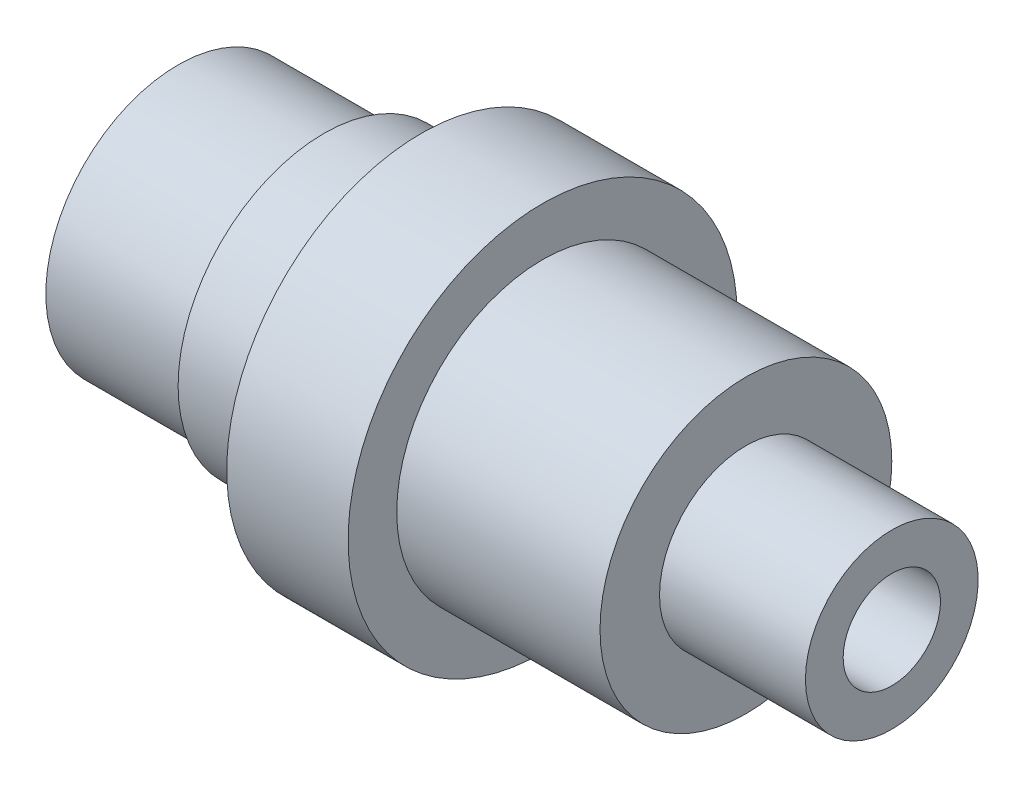
ISO-10303-21;
HEADER;
FILE_DESCRIPTION(('STEP AP214'),'2;1');
FILE_NAME('part.step','',(''),(''),'','','');
FILE_SCHEMA(('AUTOMOTIVE_DESIGN { 1 0 10303 214 1 1 1 1 }'));
ENDSEC;
DATA;
#1=APPLICATION_CONTEXT('core data for automotive mechanical design processes');
#2=APPLICATION_PROTOCOL_DEFINITION('international standard','automotive_design',2000,#1);
#3=PRODUCT_CONTEXT('',#1,'mechanical');
#4=PRODUCT('Part','Part','',(#3));
#5=PRODUCT_RELATED_PRODUCT_CATEGORY('part','',(#4));
#6=PRODUCT_DEFINITION_FORMATION('','',#4);
#7=PRODUCT_DEFINITION_CONTEXT('part definition',#1,'design');
#8=PRODUCT_DEFINITION('design','',#6,#7);
#9=PRODUCT_DEFINITION_SHAPE('','',#8);
#10=(LENGTH_UNIT() NAMED_UNIT(*) SI_UNIT(.MILLI.,.METRE.));
#11=(NAMED_UNIT(*) PLANE_ANGLE_UNIT() SI_UNIT($,.RADIAN.));
#12=(NAMED_UNIT(*) SI_UNIT($,.STERADIAN.) SOLID_ANGLE_UNIT());
#13=UNCERTAINTY_MEASURE_WITH_UNIT(LENGTH_MEASURE(1.E-05),#10,'distance_accuracy_value','');
#14=(GEOMETRIC_REPRESENTATION_CONTEXT(3) GLOBAL_UNCERTAINTY_ASSIGNED_CONTEXT((#13)) GLOBAL_UNIT_ASSIGNED_CONTEXT((#10,
#11,#12)) REPRESENTATION_CONTEXT('',''));
#15=CARTESIAN_POINT('',(0.,0.,0.));
#16=DIRECTION('',(0.,0.,1.));
#17=DIRECTION('',(1.,0.,0.));
#18=AXIS2_PLACEMENT_3D('',#15,#16,#17);
#19=CARTESIAN_POINT('',(7.9248,0.,0.));
#20=DIRECTION('',(-1.,0.,0.));
#21=DIRECTION('',(0.,0.,1.));
#22=AXIS2_PLACEMENT_3D('',#19,#20,#21);
#23=CYLINDRICAL_SURFACE('',#22,12.7);
#24=CARTESIAN_POINT('',(7.9248,0.,0.));
#25=DIRECTION('',(1.,0.,0.));
#26=DIRECTION('',(0.,0.,-1.));
#27=AXIS2_PLACEMENT_3D('',#24,#25,#26);
#28=CIRCLE('',#27,12.7);
#29=CARTESIAN_POINT('',(7.9248,0.,-12.7));
#30=VERTEX_POINT('',#29);
#31=EDGE_CURVE('E81',#30,#30,#28,.T.);
#32=ORIENTED_EDGE('',*,*,#31,.F.);
#33=EDGE_LOOP('',(#32));
#34=FACE_BOUND('',#33,.T.);
#35=CARTESIAN_POINT('',(0.,0.,0.));
#36=DIRECTION('',(1.,0.,0.));
#37=DIRECTION('',(0.,0.,-1.));
#38=AXIS2_PLACEMENT_3D('',#35,#36,#37);
#39=CIRCLE('',#38,12.7);
#40=CARTESIAN_POINT('',(0.,0.,-12.7));
#41=VERTEX_POINT('',#40);
#42=EDGE_CURVE('E46',#41,#41,#39,.T.);
#43=ORIENTED_EDGE('',*,*,#42,.T.);
#44=EDGE_LOOP('',(#43));
#45=FACE_BOUND('',#44,.T.);
#46=ADVANCED_FACE('F43',(#34,#45),#23,.T.);
#47=CARTESIAN_POINT('',(7.9248,0.,0.));
#48=DIRECTION('',(1.,0.,0.));
#49=DIRECTION('',(0.,0.,-1.));
#50=AXIS2_PLACEMENT_3D('',#47,#48,#49);
#51=PLANE('',#50);
#52=CARTESIAN_POINT('',(7.9248,0.,0.));
#53=DIRECTION('',(1.,0.,0.));
#54=DIRECTION('',(0.,0.,-1.));
#55=AXIS2_PLACEMENT_3D('',#52,#53,#54);
#56=CIRCLE('',#55,9.525);
#57=CARTESIAN_POINT('',(7.9248,0.,-9.525));
#58=VERTEX_POINT('',#57);
#59=EDGE_CURVE('E75',#58,#58,#56,.T.);
#60=ORIENTED_EDGE('',*,*,#59,.F.);
#61=EDGE_LOOP('',(#60));
#62=FACE_BOUND('',#61,.T.);
#63=ORIENTED_EDGE('',*,*,#31,.T.);
#64=EDGE_LOOP('',(#63));
#65=FACE_BOUND('',#64,.T.);
#66=ADVANCED_FACE('F94',(#62,#65),#51,.T.);
#67=CARTESIAN_POINT('',(0.,0.,0.));
#68=DIRECTION('',(1.,0.,0.));
#69=DIRECTION('',(0.,0.,-1.));
#70=AXIS2_PLACEMENT_3D('',#67,#68,#69);
#71=PLANE('',#70);
#72=CARTESIAN_POINT('',(0.,0.,0.));
#73=DIRECTION('',(-1.,0.,0.));
#74=DIRECTION('',(0.,0.,1.));
#75=AXIS2_PLACEMENT_3D('',#72,#73,#74);
#76=CIRCLE('',#75,9.525);
#77=CARTESIAN_POINT('',(0.,0.,9.525));
#78=VERTEX_POINT('',#77);
#79=EDGE_CURVE('E51',#78,#78,#76,.T.);
#80=ORIENTED_EDGE('',*,*,#79,.F.);
#81=EDGE_LOOP('',(#80));
#82=FACE_BOUND('',#81,.T.);
#83=ORIENTED_EDGE('',*,*,#42,.F.);
#84=EDGE_LOOP('',(#83));
#85=FACE_BOUND('',#84,.T.);
#86=ADVANCED_FACE('F91',(#82,#85),#71,.F.);
#87=CARTESIAN_POINT('',(21.1963,0.,0.));
#88=DIRECTION('',(-1.,0.,0.));
#89=DIRECTION('',(0.,0.,1.));
#90=AXIS2_PLACEMENT_3D('',#87,#88,#89);
#91=CYLINDRICAL_SURFACE('',#90,9.525);
#92=CARTESIAN_POINT('',(21.1963,0.,0.));
#93=DIRECTION('',(1.,0.,0.));
#94=DIRECTION('',(0.,0.,-1.));
#95=AXIS2_PLACEMENT_3D('',#92,#93,#94);
#96=CIRCLE('',#95,9.525);
#97=CARTESIAN_POINT('',(21.1963,0.,-9.525));
#98=VERTEX_POINT('',#97);
#99=EDGE_CURVE('E71',#98,#98,#96,.T.);
#100=ORIENTED_EDGE('',*,*,#99,.F.);
#101=EDGE_LOOP('',(#100));
#102=FACE_BOUND('',#101,.T.);
#103=ORIENTED_EDGE('',*,*,#59,.T.);
#104=EDGE_LOOP('',(#103));
#105=FACE_BOUND('',#104,.T.);
#106=ADVANCED_FACE('F93',(#102,#105),#91,.T.);
#107=CARTESIAN_POINT('',(21.1963,0.,0.));
#108=DIRECTION('',(1.,0.,0.));
#109=DIRECTION('',(0.,0.,-1.));
#110=AXIS2_PLACEMENT_3D('',#107,#108,#109);
#111=PLANE('',#110);
#112=CARTESIAN_POINT('',(21.1963,0.,0.));
#113=DIRECTION('',(1.,0.,0.));
#114=DIRECTION('',(0.,0.,-1.));
#115=AXIS2_PLACEMENT_3D('',#112,#113,#114);
#116=CIRCLE('',#115,5.6388);
#117=CARTESIAN_POINT('',(21.1963,0.,5.6388));
#118=VERTEX_POINT('',#117);
#119=EDGE_CURVE('E57',#118,#118,#116,.T.);
#120=ORIENTED_EDGE('',*,*,#119,.F.);
#121=EDGE_LOOP('',(#120));
#122=FACE_BOUND('',#121,.T.);
#123=ORIENTED_EDGE('',*,*,#99,.T.);
#124=EDGE_LOOP('',(#123));
#125=FACE_BOUND('',#124,.T.);
#126=ADVANCED_FACE('F101',(#122,#125),#111,.T.);
#127=CARTESIAN_POINT('',(30.7213,0.,0.));
#128=DIRECTION('',(-1.,0.,0.));
#129=DIRECTION('',(0.,0.,1.));
#130=AXIS2_PLACEMENT_3D('',#127,#128,#129);
#131=CYLINDRICAL_SURFACE('',#130,5.6388);
#132=CARTESIAN_POINT('',(30.7213,0.,0.));
#133=DIRECTION('',(1.,0.,0.));
#134=DIRECTION('',(0.,0.,-1.));
#135=AXIS2_PLACEMENT_3D('',#132,#133,#134);
#136=CIRCLE('',#135,5.6388);
#137=CARTESIAN_POINT('',(30.7213,0.,5.6388));
#138=VERTEX_POINT('',#137);
#139=EDGE_CURVE('E66',#138,#138,#136,.T.);
#140=CARTESIAN_POINT('',(30.7213,0.,5.6388));
#141=CARTESIAN_POINT('',(30.62208125,0.,5.6388));
#142=CARTESIAN_POINT('',(30.5228625,0.,5.6388));
#143=CARTESIAN_POINT('',(30.324425,0.,5.6388));
#144=CARTESIAN_POINT('',(30.22520625,0.,5.6388));
#145=CARTESIAN_POINT('',(30.02676875,0.,5.6388));
#146=CARTESIAN_POINT('',(29.92755,0.,5.6388));
#147=CARTESIAN_POINT('',(29.7291125,0.,5.6388));
#148=CARTESIAN_POINT('',(29.62989375,0.,5.6388));
#149=CARTESIAN_POINT('',(29.43145625,0.,5.6388));
#150=CARTESIAN_POINT('',(29.3322375,0.,5.6388));
#151=CARTESIAN_POINT('',(29.1338,0.,5.6388));
#152=CARTESIAN_POINT('',(29.03458125,0.,5.6388));
#153=CARTESIAN_POINT('',(28.83614375,0.,5.6388));
#154=CARTESIAN_POINT('',(28.736925,0.,5.6388));
#155=CARTESIAN_POINT('',(28.5384875,0.,5.6388));
#156=CARTESIAN_POINT('',(28.43926875,0.,5.6388));
#157=CARTESIAN_POINT('',(28.24083125,0.,5.6388));
#158=CARTESIAN_POINT('',(28.1416125,0.,5.6388));
#159=CARTESIAN_POINT('',(27.943175,0.,5.6388));
#160=CARTESIAN_POINT('',(27.84395625,0.,5.6388));
#161=CARTESIAN_POINT('',(27.64551875,0.,5.6388));
#162=CARTESIAN_POINT('',(27.5463,0.,5.6388));
#163=CARTESIAN_POINT('',(27.3478625,0.,5.6388));
#164=CARTESIAN_POINT('',(27.24864375,0.,5.6388));
#165=CARTESIAN_POINT('',(27.05020625,0.,5.6388));
#166=CARTESIAN_POINT('',(26.9509875,0.,5.6388));
#167=CARTESIAN_POINT('',(26.75255,0.,5.6388));
#168=CARTESIAN_POINT('',(26.65333125,0.,5.6388));
#169=CARTESIAN_POINT('',(26.45489375,0.,5.6388));
#170=CARTESIAN_POINT('',(26.355675,0.,5.6388));
#171=CARTESIAN_POINT('',(26.1572375,0.,5.6388));
#172=CARTESIAN_POINT('',(26.05801875,0.,5.6388));
#173=CARTESIAN_POINT('',(25.85958125,0.,5.6388));
#174=CARTESIAN_POINT('',(25.7603625,0.,5.6388));
#175=CARTESIAN_POINT('',(25.561925,0.,5.6388));
#176=CARTESIAN_POINT('',(25.46270625,0.,5.6388));
#177=CARTESIAN_POINT('',(25.26426875,0.,5.6388));
#178=CARTESIAN_POINT('',(25.16505,0.,5.6388));
#179=CARTESIAN_POINT('',(24.9666125,0.,5.6388));
#180=CARTESIAN_POINT('',(24.86739375,0.,5.6388));
#181=CARTESIAN_POINT('',(24.66895625,0.,5.6388));
#182=CARTESIAN_POINT('',(24.5697375,0.,5.6388));
#183=CARTESIAN_POINT('',(24.3713,0.,5.6388));
#184=CARTESIAN_POINT('',(24.27208125,0.,5.6388));
#185=CARTESIAN_POINT('',(24.07364375,0.,5.6388));
#186=CARTESIAN_POINT('',(23.974425,0.,5.6388));
#187=CARTESIAN_POINT('',(23.7759875,0.,5.6388));
#188=CARTESIAN_POINT('',(23.67676875,0.,5.6388));
#189=CARTESIAN_POINT('',(23.47833125,0.,5.6388));
#190=CARTESIAN_POINT('',(23.3791125,0.,5.6388));
#191=CARTESIAN_POINT('',(23.180675,0.,5.6388));
#192=CARTESIAN_POINT('',(23.08145625,0.,5.6388));
#193=CARTESIAN_POINT('',(22.88301875,0.,5.6388));
#194=CARTESIAN_POINT('',(22.7838,0.,5.6388));
#195=CARTESIAN_POINT('',(22.5853625,0.,5.6388));
#196=CARTESIAN_POINT('',(22.48614375,0.,5.6388));
#197=CARTESIAN_POINT('',(22.28770625,0.,5.6388));
#198=CARTESIAN_POINT('',(22.1884875,0.,5.6388));
#199=CARTESIAN_POINT('',(21.99005,0.,5.6388));
#200=CARTESIAN_POINT('',(21.89083125,0.,5.6388));
#201=CARTESIAN_POINT('',(21.69239375,0.,5.6388));
#202=CARTESIAN_POINT('',(21.593175,0.,5.6388));
#203=CARTESIAN_POINT('',(21.3947375,0.,5.6388));
#204=CARTESIAN_POINT('',(21.29551875,0.,5.6388));
#205=CARTESIAN_POINT('',(21.1963,0.,5.6388));
#206=B_SPLINE_CURVE_WITH_KNOTS('',3,(#140,#141,#142,#143,#144,#145,#146,#147,#148,#149,#150,
#151,#152,#153,#154,#155,#156,#157,#158,#159,#160,#161,#162,#163,#164,#165,#166,#167,#168,#169,
#170,#171,#172,#173,#174,#175,#176,#177,#178,#179,#180,#181,#182,#183,#184,#185,#186,#187,#188,
#189,#190,#191,#192,#193,#194,#195,#196,#197,#198,#199,#200,#201,#202,#203,#204,#205),
.UNSPECIFIED.,.F.,.F.,(4,2,2,2,2,2,2,2,2,2,2,2,2,2,2,2,2,2,2,2,2,2,2,2,2,2,2,2,2,2,2,2,4),(0.,
0.297656249999997,0.595312499999997,0.892968749999997,1.190625,1.48828125,1.7859375,2.08359375,
2.38125,2.67890625,2.9765625,3.27421875,3.571875,3.86953125,4.1671875,4.46484375,4.7625,
5.06015625,5.3578125,5.65546875,5.953125,6.25078125,6.5484375,6.84609375,7.14375,7.44140625,
7.7390625,8.03671875,8.334375,8.63203125,8.9296875,9.22734375,9.525),.UNSPECIFIED.);
#207=EDGE_CURVE('BSEAM128',#138,#118,#206,.T.);
#208=ORIENTED_EDGE('',*,*,#139,.F.);
#209=ORIENTED_EDGE('',*,*,#119,.T.);
#210=ORIENTED_EDGE('',*,*,#207,.T.);
#211=ORIENTED_EDGE('',*,*,#207,.F.);
#212=EDGE_LOOP('',(#208,#210,#209,#211));
#213=FACE_BOUND('',#212,.T.);
#214=ADVANCED_FACE('F128',(#213),#131,.T.);
#215=CARTESIAN_POINT('',(30.7213,0.,0.));
#216=DIRECTION('',(1.,0.,0.));
#217=DIRECTION('',(0.,0.,-1.));
#218=AXIS2_PLACEMENT_3D('',#215,#216,#217);
#219=PLANE('',#218);
#220=CARTESIAN_POINT('',(30.7213,0.,0.));
#221=DIRECTION('',(-1.,0.,0.));
#222=DIRECTION('',(0.,0.,1.));
#223=AXIS2_PLACEMENT_3D('',#220,#221,#222);
#224=CIRCLE('',#223,3.175);
#225=CARTESIAN_POINT('',(30.7213,0.,3.175));
#226=VERTEX_POINT('',#225);
#227=EDGE_CURVE('E224',#226,#226,#224,.T.);
#228=ORIENTED_EDGE('',*,*,#227,.T.);
#229=EDGE_LOOP('',(#228));
#230=FACE_BOUND('',#229,.T.);
#231=ORIENTED_EDGE('',*,*,#139,.T.);
#232=EDGE_LOOP('',(#231));
#233=FACE_BOUND('',#232,.T.);
#234=ADVANCED_FACE('F136',(#230,#233),#219,.T.);
#235=CARTESIAN_POINT('',(-6.35,0.,0.));
#236=DIRECTION('',(1.,0.,0.));
#237=DIRECTION('',(0.,0.,-1.));
#238=AXIS2_PLACEMENT_3D('',#235,#236,#237);
#239=CYLINDRICAL_SURFACE('',#238,9.525);
#240=CARTESIAN_POINT('',(-6.35,0.,0.));
#241=DIRECTION('',(-1.,0.,0.));
#242=DIRECTION('',(0.,0.,1.));
#243=AXIS2_PLACEMENT_3D('',#240,#241,#242);
#244=CIRCLE('',#243,9.525);
#245=CARTESIAN_POINT('',(-6.35,0.,9.525));
#246=VERTEX_POINT('',#245);
#247=EDGE_CURVE('E63',#246,#246,#244,.T.);
#248=ORIENTED_EDGE('',*,*,#247,.F.);
#249=EDGE_LOOP('',(#248));
#250=FACE_BOUND('',#249,.T.);
#251=ORIENTED_EDGE('',*,*,#79,.T.);
#252=EDGE_LOOP('',(#251));
#253=FACE_BOUND('',#252,.T.);
#254=ADVANCED_FACE('F149',(#250,#253),#239,.T.);
#255=CARTESIAN_POINT('',(-6.35,0.,0.));
#256=DIRECTION('',(-1.,0.,0.));
#257=DIRECTION('',(0.,0.,1.));
#258=AXIS2_PLACEMENT_3D('',#255,#256,#257);
#259=PLANE('',#258);
#260=CARTESIAN_POINT('',(-6.35,0.,0.));
#261=DIRECTION('',(-1.,0.,0.));
#262=DIRECTION('',(0.,0.,1.));
#263=AXIS2_PLACEMENT_3D('',#260,#261,#262);
#264=CIRCLE('',#263,8.636);
#265=CARTESIAN_POINT('',(-6.35,0.,-8.636));
#266=VERTEX_POINT('',#265);
#267=EDGE_CURVE('E10',#266,#266,#264,.T.);
#268=ORIENTED_EDGE('',*,*,#267,.F.);
#269=EDGE_LOOP('',(#268));
#270=FACE_BOUND('',#269,.T.);
#271=ORIENTED_EDGE('',*,*,#247,.T.);
#272=EDGE_LOOP('',(#271));
#273=FACE_BOUND('',#272,.T.);
#274=ADVANCED_FACE('F160',(#270,#273),#259,.T.);
#275=CARTESIAN_POINT('',(-15.875,0.,0.));
#276=DIRECTION('',(1.,0.,0.));
#277=DIRECTION('',(0.,0.,-1.));
#278=AXIS2_PLACEMENT_3D('',#275,#276,#277);
#279=CYLINDRICAL_SURFACE('',#278,8.636);
#280=CARTESIAN_POINT('',(-15.875,0.,0.));
#281=DIRECTION('',(-1.,0.,0.));
#282=DIRECTION('',(0.,0.,1.));
#283=AXIS2_PLACEMENT_3D('',#280,#281,#282);
#284=CIRCLE('',#283,8.636);
#285=CARTESIAN_POINT('',(-15.875,0.,-8.636));
#286=VERTEX_POINT('',#285);
#287=EDGE_CURVE('E61',#286,#286,#284,.T.);
#288=CARTESIAN_POINT('',(-15.875,0.,-8.636));
#289=CARTESIAN_POINT('',(-15.77578125,0.,-8.636));
#290=CARTESIAN_POINT('',(-15.6765625,0.,-8.636));
#291=CARTESIAN_POINT('',(-15.478125,0.,-8.636));
#292=CARTESIAN_POINT('',(-15.37890625,0.,-8.636));
#293=CARTESIAN_POINT('',(-15.18046875,0.,-8.636));
#294=CARTESIAN_POINT('',(-15.08125,0.,-8.636));
#295=CARTESIAN_POINT('',(-14.8828125,0.,-8.636));
#296=CARTESIAN_POINT('',(-14.78359375,0.,-8.636));
#297=CARTESIAN_POINT('',(-14.58515625,0.,-8.636));
#298=CARTESIAN_POINT('',(-14.4859375,0.,-8.636));
#299=CARTESIAN_POINT('',(-14.2875,0.,-8.636));
#300=CARTESIAN_POINT('',(-14.18828125,0.,-8.636));
#301=CARTESIAN_POINT('',(-13.98984375,0.,-8.636));
#302=CARTESIAN_POINT('',(-13.890625,0.,-8.636));
#303=CARTESIAN_POINT('',(-13.6921875,0.,-8.636));
#304=CARTESIAN_POINT('',(-13.59296875,0.,-8.636));
#305=CARTESIAN_POINT('',(-13.39453125,0.,-8.636));
#306=CARTESIAN_POINT('',(-13.2953125,0.,-8.636));
#307=CARTESIAN_POINT('',(-13.096875,0.,-8.636));
#308=CARTESIAN_POINT('',(-12.99765625,0.,-8.636));
#309=CARTESIAN_POINT('',(-12.79921875,0.,-8.636));
#310=CARTESIAN_POINT('',(-12.7,0.,-8.636));
#311=CARTESIAN_POINT('',(-12.5015625,0.,-8.636));
#312=CARTESIAN_POINT('',(-12.40234375,0.,-8.636));
#313=CARTESIAN_POINT('',(-12.20390625,0.,-8.636));
#314=CARTESIAN_POINT('',(-12.1046875,0.,-8.636));
#315=CARTESIAN_POINT('',(-11.90625,0.,-8.636));
#316=CARTESIAN_POINT('',(-11.80703125,0.,-8.636));
#317=CARTESIAN_POINT('',(-11.60859375,0.,-8.636));
#318=CARTESIAN_POINT('',(-11.509375,0.,-8.636));
#319=CARTESIAN_POINT('',(-11.3109375,0.,-8.636));
#320=CARTESIAN_POINT('',(-11.21171875,0.,-8.636));
#321=CARTESIAN_POINT('',(-11.01328125,0.,-8.636));
#322=CARTESIAN_POINT('',(-10.9140625,0.,-8.636));
#323=CARTESIAN_POINT('',(-10.715625,0.,-8.636));
#324=CARTESIAN_POINT('',(-10.61640625,0.,-8.636));
#325=CARTESIAN_POINT('',(-10.41796875,0.,-8.636));
#326=CARTESIAN_POINT('',(-10.31875,0.,-8.636));
#327=CARTESIAN_POINT('',(-10.1203125,0.,-8.636));
#328=CARTESIAN_POINT('',(-10.02109375,0.,-8.636));
#329=CARTESIAN_POINT('',(-9.82265625,0.,-8.636));
#330=CARTESIAN_POINT('',(-9.7234375,0.,-8.636));
#331=CARTESIAN_POINT('',(-9.525,0.,-8.636));
#332=CARTESIAN_POINT('',(-9.42578125,0.,-8.636));
#333=CARTESIAN_POINT('',(-9.22734375,0.,-8.636));
#334=CARTESIAN_POINT('',(-9.128125,0.,-8.636));
#335=CARTESIAN_POINT('',(-8.9296875,0.,-8.636));
#336=CARTESIAN_POINT('',(-8.83046875,0.,-8.636));
#337=CARTESIAN_POINT('',(-8.63203125,0.,-8.636));
#338=CARTESIAN_POINT('',(-8.5328125,0.,-8.636));
#339=CARTESIAN_POINT('',(-8.334375,0.,-8.636));
#340=CARTESIAN_POINT('',(-8.23515625,0.,-8.636));
#341=CARTESIAN_POINT('',(-8.03671875,0.,-8.636));
#342=CARTESIAN_POINT('',(-7.9375,0.,-8.636));
#343=CARTESIAN_POINT('',(-7.7390625,0.,-8.636));
#344=CARTESIAN_POINT('',(-7.63984375,0.,-8.636));
#345=CARTESIAN_POINT('',(-7.44140625,0.,-8.636));
#346=CARTESIAN_POINT('',(-7.3421875,0.,-8.636));
#347=CARTESIAN_POINT('',(-7.14375,0.,-8.636));
#348=CARTESIAN_POINT('',(-7.04453125,0.,-8.636));
#349=CARTESIAN_POINT('',(-6.84609375,0.,-8.636));
#350=CARTESIAN_POINT('',(-6.746875,0.,-8.636));
#351=CARTESIAN_POINT('',(-6.5484375,0.,-8.636));
#352=CARTESIAN_POINT('',(-6.44921875,0.,-8.636));
#353=CARTESIAN_POINT('',(-6.35,0.,-8.636));
#354=B_SPLINE_CURVE_WITH_KNOTS('',3,(#288,#289,#290,#291,#292,#293,#294,#295,#296,#297,#298,
#299,#300,#301,#302,#303,#304,#305,#306,#307,#308,#309,#310,#311,#312,#313,#314,#315,#316,#317,
#318,#319,#320,#321,#322,#323,#324,#325,#326,#327,#328,#329,#330,#331,#332,#333,#334,#335,#336,
#337,#338,#339,#340,#341,#342,#343,#344,#345,#346,#347,#348,#349,#350,#351,#352,#353),
.UNSPECIFIED.,.F.,.F.,(4,2,2,2,2,2,2,2,2,2,2,2,2,2,2,2,2,2,2,2,2,2,2,2,2,2,2,2,2,2,2,2,4),(0.,
0.297656249999998,0.595312499999999,0.892968749999999,1.190625,1.48828125,1.7859375,2.08359375,
2.38125,2.67890625,2.9765625,3.27421875,3.571875,3.86953125,4.1671875,4.46484375,4.7625,
5.06015625,5.3578125,5.65546875,5.953125,6.25078125,6.5484375,6.84609375,7.14375,7.44140625,
7.7390625,8.03671875,8.334375,8.63203125,8.9296875,9.22734375,9.525),.UNSPECIFIED.);
#355=EDGE_CURVE('BSEAM170',#286,#266,#354,.T.);
#356=ORIENTED_EDGE('',*,*,#287,.F.);
#357=ORIENTED_EDGE('',*,*,#267,.T.);
#358=ORIENTED_EDGE('',*,*,#355,.T.);
#359=ORIENTED_EDGE('',*,*,#355,.F.);
#360=EDGE_LOOP('',(#356,#358,#357,#359));
#361=FACE_BOUND('',#360,.T.);
#362=ADVANCED_FACE('F170',(#361),#279,.T.);
#363=CARTESIAN_POINT('',(-15.875,0.,0.));
#364=DIRECTION('',(-1.,0.,0.));
#365=DIRECTION('',(0.,0.,1.));
#366=AXIS2_PLACEMENT_3D('',#363,#364,#365);
#367=PLANE('',#366);
#368=CARTESIAN_POINT('',(-15.875,0.,0.));
#369=DIRECTION('',(-1.,0.,0.));
#370=DIRECTION('',(0.,0.,1.));
#371=AXIS2_PLACEMENT_3D('',#368,#369,#370);
#372=CIRCLE('',#371,6.35);
#373=CARTESIAN_POINT('',(-15.875,0.,6.35));
#374=VERTEX_POINT('',#373);
#375=EDGE_CURVE('E231',#374,#374,#372,.T.);
#376=ORIENTED_EDGE('',*,*,#375,.F.);
#377=EDGE_LOOP('',(#376));
#378=FACE_BOUND('',#377,.T.);
#379=ORIENTED_EDGE('',*,*,#287,.T.);
#380=EDGE_LOOP('',(#379));
#381=FACE_BOUND('',#380,.T.);
#382=ADVANCED_FACE('F180',(#378,#381),#367,.T.);
#383=CARTESIAN_POINT('',(9.525,0.,0.));
#384=DIRECTION('',(-1.,0.,0.));
#385=DIRECTION('',(0.,0.,1.));
#386=AXIS2_PLACEMENT_3D('',#383,#384,#385);
#387=CYLINDRICAL_SURFACE('',#386,6.35);
#388=CARTESIAN_POINT('',(9.525,0.,0.));
#389=DIRECTION('',(-1.,0.,0.));
#390=DIRECTION('',(0.,0.,1.));
#391=AXIS2_PLACEMENT_3D('',#388,#389,#390);
#392=CIRCLE('',#391,6.35);
#393=CARTESIAN_POINT('',(9.525,0.,6.35));
#394=VERTEX_POINT('',#393);
#395=EDGE_CURVE('E234',#394,#394,#392,.T.);
#396=ORIENTED_EDGE('',*,*,#395,.F.);
#397=EDGE_LOOP('',(#396));
#398=FACE_BOUND('',#397,.T.);
#399=ORIENTED_EDGE('',*,*,#375,.T.);
#400=EDGE_LOOP('',(#399));
#401=FACE_BOUND('',#400,.T.);
#402=ADVANCED_FACE('F190',(#398,#401),#387,.F.);
#403=CARTESIAN_POINT('',(9.525,0.,0.));
#404=DIRECTION('',(-1.,0.,0.));
#405=DIRECTION('',(0.,0.,1.));
#406=AXIS2_PLACEMENT_3D('',#403,#404,#405);
#407=PLANE('',#406);
#408=CARTESIAN_POINT('',(9.525,0.,0.));
#409=DIRECTION('',(-1.,0.,0.));
#410=DIRECTION('',(0.,0.,1.));
#411=AXIS2_PLACEMENT_3D('',#408,#409,#410);
#412=CIRCLE('',#411,3.175);
#413=CARTESIAN_POINT('',(9.525,0.,3.175));
#414=VERTEX_POINT('',#413);
#415=EDGE_CURVE('E227',#414,#414,#412,.T.);
#416=ORIENTED_EDGE('',*,*,#415,.F.);
#417=EDGE_LOOP('',(#416));
#418=FACE_BOUND('',#417,.T.);
#419=ORIENTED_EDGE('',*,*,#395,.T.);
#420=EDGE_LOOP('',(#419));
#421=FACE_BOUND('',#420,.T.);
#422=ADVANCED_FACE('F199',(#418,#421),#407,.T.);
#423=CARTESIAN_POINT('',(30.7213,0.,0.));
#424=DIRECTION('',(-1.,0.,0.));
#425=DIRECTION('',(0.,0.,1.));
#426=AXIS2_PLACEMENT_3D('',#423,#424,#425);
#427=CYLINDRICAL_SURFACE('',#426,3.175);
#428=CARTESIAN_POINT('',(30.7213,0.,3.175));
#429=CARTESIAN_POINT('',(30.5005052083333,0.,3.175));
#430=CARTESIAN_POINT('',(30.2797104166667,0.,3.175));
#431=CARTESIAN_POINT('',(29.8381208333333,0.,3.175));
#432=CARTESIAN_POINT('',(29.6173260416667,0.,3.175));
#433=CARTESIAN_POINT('',(29.1757364583333,0.,3.175));
#434=CARTESIAN_POINT('',(28.9549416666667,0.,3.175));
#435=CARTESIAN_POINT('',(28.5133520833333,0.,3.175));
#436=CARTESIAN_POINT('',(28.2925572916667,0.,3.175));
#437=CARTESIAN_POINT('',(27.8509677083333,0.,3.175));
#438=CARTESIAN_POINT('',(27.6301729166667,0.,3.175));
#439=CARTESIAN_POINT('',(27.1885833333333,0.,3.175));
#440=CARTESIAN_POINT('',(26.9677885416667,0.,3.175));
#441=CARTESIAN_POINT('',(26.5261989583333,0.,3.175));
#442=CARTESIAN_POINT('',(26.3054041666667,0.,3.175));
#443=CARTESIAN_POINT('',(25.8638145833333,0.,3.175));
#444=CARTESIAN_POINT('',(25.6430197916667,0.,3.175));
#445=CARTESIAN_POINT('',(25.2014302083333,0.,3.175));
#446=CARTESIAN_POINT('',(24.9806354166667,0.,3.175));
#447=CARTESIAN_POINT('',(24.5390458333333,0.,3.175));
#448=CARTESIAN_POINT('',(24.3182510416667,0.,3.175));
#449=CARTESIAN_POINT('',(23.8766614583333,0.,3.175));
#450=CARTESIAN_POINT('',(23.6558666666667,0.,3.175));
#451=CARTESIAN_POINT('',(23.2142770833333,0.,3.175));
#452=CARTESIAN_POINT('',(22.9934822916667,0.,3.175));
#453=CARTESIAN_POINT('',(22.5518927083333,0.,3.175));
#454=CARTESIAN_POINT('',(22.3310979166667,0.,3.175));
#455=CARTESIAN_POINT('',(21.8895083333333,0.,3.175));
#456=CARTESIAN_POINT('',(21.6687135416667,0.,3.175));
#457=CARTESIAN_POINT('',(21.2271239583333,0.,3.175));
#458=CARTESIAN_POINT('',(21.0063291666667,0.,3.175));
#459=CARTESIAN_POINT('',(20.5647395833333,0.,3.175));
#460=CARTESIAN_POINT('',(20.3439447916667,0.,3.175));
#461=CARTESIAN_POINT('',(19.9023552083333,0.,3.175));
#462=CARTESIAN_POINT('',(19.6815604166667,0.,3.175));
#463=CARTESIAN_POINT('',(19.2399708333333,0.,3.175));
#464=CARTESIAN_POINT('',(19.0191760416667,0.,3.175));
#465=CARTESIAN_POINT('',(18.5775864583333,0.,3.175));
#466=CARTESIAN_POINT('',(18.3567916666667,0.,3.175));
#467=CARTESIAN_POINT('',(17.9152020833333,0.,3.175));
#468=CARTESIAN_POINT('',(17.6944072916667,0.,3.175));
#469=CARTESIAN_POINT('',(17.2528177083333,0.,3.175));
#470=CARTESIAN_POINT('',(17.0320229166667,0.,3.175));
#471=CARTESIAN_POINT('',(16.5904333333333,0.,3.175));
#472=CARTESIAN_POINT('',(16.3696385416667,0.,3.175));
#473=CARTESIAN_POINT('',(15.9280489583333,0.,3.175));
#474=CARTESIAN_POINT('',(15.7072541666667,0.,3.175));
#475=CARTESIAN_POINT('',(15.2656645833333,0.,3.175));
#476=CARTESIAN_POINT('',(15.0448697916667,0.,3.175));
#477=CARTESIAN_POINT('',(14.6032802083333,0.,3.175));
#478=CARTESIAN_POINT('',(14.3824854166667,0.,3.175));
#479=CARTESIAN_POINT('',(13.9408958333333,0.,3.175));
#480=CARTESIAN_POINT('',(13.7201010416667,0.,3.175));
#481=CARTESIAN_POINT('',(13.2785114583333,0.,3.175));
#482=CARTESIAN_POINT('',(13.0577166666667,0.,3.175));
#483=CARTESIAN_POINT('',(12.6161270833333,0.,3.175));
#484=CARTESIAN_POINT('',(12.3953322916667,0.,3.175));
#485=CARTESIAN_POINT('',(11.9537427083333,0.,3.175));
#486=CARTESIAN_POINT('',(11.7329479166667,0.,3.175));
#487=CARTESIAN_POINT('',(11.2913583333333,0.,3.175));
#488=CARTESIAN_POINT('',(11.0705635416667,0.,3.175));
#489=CARTESIAN_POINT('',(10.6289739583333,0.,3.175));
#490=CARTESIAN_POINT('',(10.4081791666667,0.,3.175));
#491=CARTESIAN_POINT('',(9.96658958333333,0.,3.175));
#492=CARTESIAN_POINT('',(9.74579479166667,0.,3.175));
#493=CARTESIAN_POINT('',(9.525,0.,3.175));
#494=B_SPLINE_CURVE_WITH_KNOTS('',3,(#428,#429,#430,#431,#432,#433,#434,#435,#436,#437,#438,
#439,#440,#441,#442,#443,#444,#445,#446,#447,#448,#449,#450,#451,#452,#453,#454,#455,#456,#457,
#458,#459,#460,#461,#462,#463,#464,#465,#466,#467,#468,#469,#470,#471,#472,#473,#474,#475,#476,
#477,#478,#479,#480,#481,#482,#483,#484,#485,#486,#487,#488,#489,#490,#491,#492,#493),
.UNSPECIFIED.,.F.,.F.,(4,2,2,2,2,2,2,2,2,2,2,2,2,2,2,2,2,2,2,2,2,2,2,2,2,2,2,2,2,2,2,2,4),(0.,
0.662384374999998,1.32476875,1.987153125,2.6495375,3.311921875,3.97430625,4.636690625,5.299075,
5.961459375,6.62384375,7.286228125,7.9486125,8.610996875,9.27338125,9.93576562499999,10.59815,
11.260534375,11.92291875,12.585303125,13.2476875,13.910071875,14.57245625,15.234840625,
15.897225,16.559609375,17.22199375,17.884378125,18.5467625,19.209146875,19.87153125,
20.533915625,21.1963),.UNSPECIFIED.);
#495=EDGE_CURVE('BSEAM208',#226,#414,#494,.T.);
#496=ORIENTED_EDGE('',*,*,#227,.F.);
#497=ORIENTED_EDGE('',*,*,#415,.T.);
#498=ORIENTED_EDGE('',*,*,#495,.T.);
#499=ORIENTED_EDGE('',*,*,#495,.F.);
#500=EDGE_LOOP('',(#496,#498,#497,#499));
#501=FACE_BOUND('',#500,.T.);
#502=ADVANCED_FACE('F208',(#501),#427,.F.);
#503=CLOSED_SHELL('',(#46,#66,#86,#106,#126,#214,#234,#254,#274,#362,#382,#402,#422,#502));
#504=MANIFOLD_SOLID_BREP('B2',#503);
#505=ADVANCED_BREP_SHAPE_REPRESENTATION('',(#18,#504),#14);
#506=SHAPE_DEFINITION_REPRESENTATION(#9,#505);
ENDSEC;
END-ISO-10303-21;
